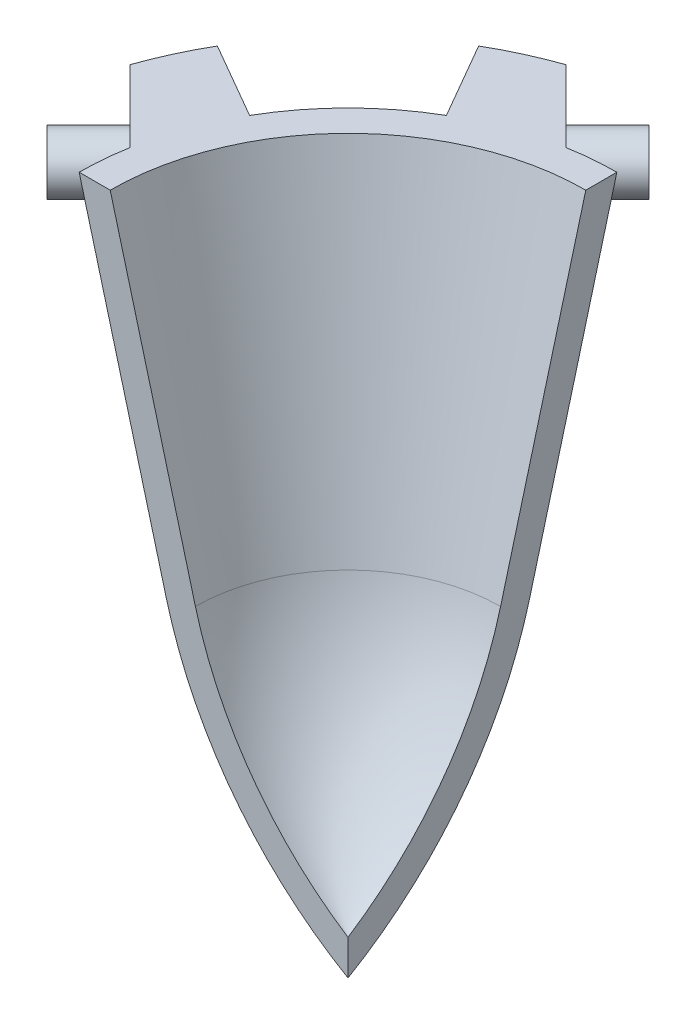
ISO-10303-21;
HEADER;
FILE_DESCRIPTION(('STEP AP214'),'2;1');
FILE_NAME('part.step','',(''),(''),'','','');
FILE_SCHEMA(('AUTOMOTIVE_DESIGN { 1 0 10303 214 1 1 1 1 }'));
ENDSEC;
DATA;
#1=APPLICATION_CONTEXT('core data for automotive mechanical design processes');
#2=APPLICATION_PROTOCOL_DEFINITION('international standard','automotive_design',2000,#1);
#3=PRODUCT_CONTEXT('',#1,'mechanical');
#4=PRODUCT('Part','Part','',(#3));
#5=PRODUCT_RELATED_PRODUCT_CATEGORY('part','',(#4));
#6=PRODUCT_DEFINITION_FORMATION('','',#4);
#7=PRODUCT_DEFINITION_CONTEXT('part definition',#1,'design');
#8=PRODUCT_DEFINITION('design','',#6,#7);
#9=PRODUCT_DEFINITION_SHAPE('','',#8);
#10=(LENGTH_UNIT() NAMED_UNIT(*) SI_UNIT(.MILLI.,.METRE.));
#11=(NAMED_UNIT(*) PLANE_ANGLE_UNIT() SI_UNIT($,.RADIAN.));
#12=(NAMED_UNIT(*) SI_UNIT($,.STERADIAN.) SOLID_ANGLE_UNIT());
#13=UNCERTAINTY_MEASURE_WITH_UNIT(LENGTH_MEASURE(1.E-05),#10,'distance_accuracy_value','');
#14=(GEOMETRIC_REPRESENTATION_CONTEXT(3) GLOBAL_UNCERTAINTY_ASSIGNED_CONTEXT((#13)) GLOBAL_UNIT_ASSIGNED_CONTEXT((#10,
#11,#12)) REPRESENTATION_CONTEXT('',''));
#15=CARTESIAN_POINT('',(0.,0.,0.));
#16=DIRECTION('',(0.,0.,1.));
#17=DIRECTION('',(1.,0.,0.));
#18=AXIS2_PLACEMENT_3D('',#15,#16,#17);
#19=CARTESIAN_POINT('',(0.,40.4976669186349,0.));
#20=DIRECTION('',(0.,1.,0.));
#21=DIRECTION('',(0.,0.,1.));
#22=AXIS2_PLACEMENT_3D('',#19,#20,#21);
#23=CONICAL_SURFACE('',#22,30.9350142441838,0.26179938779915);
#24=DIRECTION('',(0.25488700224418,-0.965925826289068,0.0449434555275456));
#25=VECTOR('',#24,1.);
#26=CARTESIAN_POINT('',(-41.1527344229323,80.9999999999999,-7.2563374086927));
#27=LINE('',#26,#25);
#28=CARTESIAN_POINT('',(-45.1109110547252,96.,-7.95427074328768));
#29=VERTEX_POINT('',#28);
#30=CARTESIAN_POINT('',(-41.1527344229322,80.9999999999999,-7.25633740869269));
#31=VERTEX_POINT('',#30);
#32=EDGE_CURVE('E70',#29,#31,#27,.T.);
#33=ORIENTED_EDGE('',*,*,#32,.T.);
#34=CARTESIAN_POINT('',(0.,80.9999999999999,1.34098829323386E-13));
#35=DIRECTION('',(0.,-1.,0.));
#36=DIRECTION('',(0.,0.,-1.));
#37=AXIS2_PLACEMENT_3D('',#34,#35,#36);
#38=CIRCLE('',#37,41.787581684912);
#39=CARTESIAN_POINT('',(-36.1891073018512,81.,-20.8937908424558));
#40=VERTEX_POINT('',#39);
#41=EDGE_CURVE('E282',#31,#40,#38,.T.);
#42=ORIENTED_EDGE('',*,*,#41,.T.);
#43=DIRECTION('',(0.224143868042015,-0.965925826289068,0.129409522551259));
#44=VECTOR('',#43,1.);
#45=CARTESIAN_POINT('',(-36.1891073018512,81.,-20.8937908424558));
#46=LINE('',#45,#44);
#47=CARTESIAN_POINT('',(-39.6698694153843,96.,-22.9034097856892));
#48=VERTEX_POINT('',#47);
#49=EDGE_CURVE('E302',#48,#40,#46,.T.);
#50=ORIENTED_EDGE('',*,*,#49,.F.);
#51=CARTESIAN_POINT('',(0.,96.,0.));
#52=DIRECTION('',(0.,-1.,0.));
#53=DIRECTION('',(0.,0.,-1.));
#54=AXIS2_PLACEMENT_3D('',#51,#52,#53);
#55=CIRCLE('',#54,45.8068195713788);
#56=CARTESIAN_POINT('',(-22.9034097856895,96.,-39.6698694153842));
#57=VERTEX_POINT('',#56);
#58=EDGE_CURVE('E239',#48,#57,#55,.T.);
#59=ORIENTED_EDGE('',*,*,#58,.T.);
#60=DIRECTION('',(0.129409522551262,-0.965925826289068,0.224143868042013));
#61=VECTOR('',#60,1.);
#62=CARTESIAN_POINT('',(-20.8937908424561,81.,-36.189107301851));
#63=LINE('',#62,#61);
#64=CARTESIAN_POINT('',(-20.8937908424561,81.,-36.189107301851));
#65=VERTEX_POINT('',#64);
#66=EDGE_CURVE('E262',#57,#65,#63,.T.);
#67=ORIENTED_EDGE('',*,*,#66,.T.);
#68=CARTESIAN_POINT('',(0.,80.9999999999999,1.34098829323386E-13));
#69=DIRECTION('',(0.,1.,0.));
#70=DIRECTION('',(0.,0.,1.));
#71=AXIS2_PLACEMENT_3D('',#68,#69,#70);
#72=CIRCLE('',#71,41.787581684912);
#73=CARTESIAN_POINT('',(-7.25633740869296,81.,-41.152734422932));
#74=VERTEX_POINT('',#73);
#75=EDGE_CURVE('E177',#74,#65,#72,.T.);
#76=ORIENTED_EDGE('',*,*,#75,.F.);
#77=DIRECTION('',(0.0449434555275482,-0.965925826289068,0.254887002244179));
#78=VECTOR('',#77,1.);
#79=CARTESIAN_POINT('',(-7.25633740869299,81.,-41.1527344229322));
#80=LINE('',#79,#78);
#81=CARTESIAN_POINT('',(-7.95427074328785,96.,-45.1109110547252));
#82=VERTEX_POINT('',#81);
#83=EDGE_CURVE('E187',#82,#74,#80,.T.);
#84=ORIENTED_EDGE('',*,*,#83,.F.);
#85=CARTESIAN_POINT('',(0.,96.,-45.8068195713788));
#86=VERTEX_POINT('',#85);
#87=EDGE_CURVE('E168',#82,#86,#55,.T.);
#88=ORIENTED_EDGE('',*,*,#87,.T.);
#89=DIRECTION('',(0.,0.965925826289068,-0.258819045102521));
#90=VECTOR('',#89,1.);
#91=CARTESIAN_POINT('',(0.,96.,-45.8068195713788));
#92=LINE('',#91,#90);
#93=CARTESIAN_POINT('',(0.,40.4976669186349,-30.9350142441838));
#94=VERTEX_POINT('',#93);
#95=EDGE_CURVE('E194',#94,#86,#92,.T.);
#96=ORIENTED_EDGE('',*,*,#95,.F.);
#97=CARTESIAN_POINT('',(0.,40.4976669186349,0.));
#98=DIRECTION('',(0.,-1.,0.));
#99=DIRECTION('',(0.,0.,-1.));
#100=AXIS2_PLACEMENT_3D('',#97,#98,#99);
#101=CIRCLE('',#100,30.9350142441838);
#102=CARTESIAN_POINT('',(-30.9350142441838,40.4976669186349,1.08009024950414E-13));
#103=VERTEX_POINT('',#102);
#104=EDGE_CURVE('E232',#103,#94,#101,.T.);
#105=ORIENTED_EDGE('',*,*,#104,.F.);
#106=DIRECTION('',(-0.258819045102521,0.965925826289068,0.));
#107=VECTOR('',#106,1.);
#108=CARTESIAN_POINT('',(-45.8068195713788,96.,1.59933655725223E-13));
#109=LINE('',#108,#107);
#110=CARTESIAN_POINT('',(-45.8068195713788,96.,1.59933655725223E-13));
#111=VERTEX_POINT('',#110);
#112=EDGE_CURVE('E212',#103,#111,#109,.T.);
#113=ORIENTED_EDGE('',*,*,#112,.T.);
#114=EDGE_CURVE('E235',#111,#29,#55,.T.);
#115=ORIENTED_EDGE('',*,*,#114,.T.);
#116=EDGE_LOOP('',(#33,#42,#50,#59,#67,#76,#84,#88,#96,#105,#113,#115));
#117=FACE_BOUND('',#116,.T.);
#118=ADVANCED_FACE('F46',(#117),#23,.T.);
#119=CARTESIAN_POINT('',(0.,57.8220104129191,33.7203158842601));
#120=DIRECTION('',(-1.,0.,0.));
#121=DIRECTION('',(0.,0.,-1.));
#122=AXIS2_PLACEMENT_3D('',#119,#120,#121);
#123=CIRCLE('',#122,66.9361232185283);
#124=TRIMMED_CURVE('',#123,(PARAMETER_VALUE(-1.04284047340818)),
(PARAMETER_VALUE(1.04284047340818)),.T.,.PARAMETER.);
#125=CARTESIAN_POINT('',(0.,57.8220104129191,0.));
#126=DIRECTION('',(0.,-1.,0.));
#127=AXIS1_PLACEMENT('',#125,#126);
#128=SURFACE_OF_REVOLUTION('',#124,#127);
#129=CARTESIAN_POINT('',(0.,57.8220104129191,33.7203158842601));
#130=DIRECTION('',(1.,0.,0.));
#131=DIRECTION('',(0.,0.,1.));
#132=AXIS2_PLACEMENT_3D('',#129,#130,#131);
#133=CIRCLE('',#132,66.9361232185283);
#134=CARTESIAN_POINT('',(0.,0.,0.));
#135=VERTEX_POINT('',#134);
#136=EDGE_CURVE('E185',#135,#94,#133,.T.);
#137=ORIENTED_EDGE('',*,*,#136,.F.);
#138=CARTESIAN_POINT('',(33.7203158842601,57.8220104129191,-1.1773385364979E-13));
#139=DIRECTION('',(0.,0.,-1.));
#140=DIRECTION('',(1.,0.,0.));
#141=AXIS2_PLACEMENT_3D('',#138,#139,#140);
#142=CIRCLE('',#141,66.9361232185283);
#143=EDGE_CURVE('E208',#135,#103,#142,.T.);
#144=ORIENTED_EDGE('',*,*,#143,.T.);
#145=ORIENTED_EDGE('',*,*,#104,.T.);
#146=EDGE_LOOP('',(#137,#144,#145));
#147=FACE_BOUND('',#146,.T.);
#148=ADVANCED_FACE('F367',(#147),#128,.T.);
#149=CARTESIAN_POINT('',(0.,57.8220104129191,33.7203158842601));
#150=DIRECTION('',(-1.,0.,0.));
#151=DIRECTION('',(0.,0.,-1.));
#152=AXIS2_PLACEMENT_3D('',#149,#150,#151);
#153=CIRCLE('',#152,61.8270205215404);
#154=TRIMMED_CURVE('',#153,(PARAMETER_VALUE(-0.993932782259442)),
(PARAMETER_VALUE(0.993932782259442)),.T.,.PARAMETER.);
#155=CARTESIAN_POINT('',(0.,57.8220104129191,0.));
#156=DIRECTION('',(0.,-1.,0.));
#157=AXIS1_PLACEMENT('',#155,#156);
#158=SURFACE_OF_REVOLUTION('',#154,#157);
#159=CARTESIAN_POINT('',(0.,41.82,0.));
#160=DIRECTION('',(0.,-1.,0.));
#161=DIRECTION('',(0.,0.,-1.));
#162=AXIS2_PLACEMENT_3D('',#159,#160,#161);
#163=CIRCLE('',#162,26.);
#164=CARTESIAN_POINT('',(-26.,41.82,0.));
#165=VERTEX_POINT('',#164);
#166=CARTESIAN_POINT('',(0.,41.82,-26.));
#167=VERTEX_POINT('',#166);
#168=EDGE_CURVE('E242',#165,#167,#163,.T.);
#169=ORIENTED_EDGE('',*,*,#168,.F.);
#170=CARTESIAN_POINT('',(33.7203158842601,57.8220104129191,-1.1773385364979E-13));
#171=DIRECTION('',(0.,0.,1.));
#172=DIRECTION('',(-1.,0.,0.));
#173=AXIS2_PLACEMENT_3D('',#170,#171,#172);
#174=CIRCLE('',#173,61.8270205215404);
#175=CARTESIAN_POINT('',(0.,6.,0.));
#176=VERTEX_POINT('',#175);
#177=EDGE_CURVE('E224',#165,#176,#174,.T.);
#178=ORIENTED_EDGE('',*,*,#177,.T.);
#179=CARTESIAN_POINT('',(0.,57.8220104129191,33.7203158842601));
#180=DIRECTION('',(-1.,0.,0.));
#181=DIRECTION('',(0.,0.,-1.));
#182=AXIS2_PLACEMENT_3D('',#179,#180,#181);
#183=CIRCLE('',#182,61.8270205215404);
#184=EDGE_CURVE('E206',#167,#176,#183,.T.);
#185=ORIENTED_EDGE('',*,*,#184,.F.);
#186=EDGE_LOOP('',(#169,#178,#185));
#187=FACE_BOUND('',#186,.T.);
#188=ADVANCED_FACE('F48',(#187),#158,.F.);
#189=CARTESIAN_POINT('',(0.,96.,0.));
#190=DIRECTION('',(0.,1.,0.));
#191=DIRECTION('',(0.,0.,1.));
#192=AXIS2_PLACEMENT_3D('',#189,#190,#191);
#193=CONICAL_SURFACE('',#192,40.5174872459183,0.26179938779915);
#194=CARTESIAN_POINT('',(0.,96.,0.));
#195=DIRECTION('',(0.,-1.,0.));
#196=DIRECTION('',(0.,0.,-1.));
#197=AXIS2_PLACEMENT_3D('',#194,#195,#196);
#198=CIRCLE('',#197,40.5174872459183);
#199=CARTESIAN_POINT('',(-40.5174872459183,96.,1.41466050615938E-13));
#200=VERTEX_POINT('',#199);
#201=CARTESIAN_POINT('',(0.,96.,-40.5174872459183));
#202=VERTEX_POINT('',#201);
#203=EDGE_CURVE('E238',#200,#202,#198,.T.);
#204=ORIENTED_EDGE('',*,*,#203,.F.);
#205=DIRECTION('',(0.258819045102522,-0.965925826289068,0.));
#206=VECTOR('',#205,1.);
#207=CARTESIAN_POINT('',(-26.,41.82,0.));
#208=LINE('',#207,#206);
#209=EDGE_CURVE('E220',#200,#165,#208,.T.);
#210=ORIENTED_EDGE('',*,*,#209,.T.);
#211=ORIENTED_EDGE('',*,*,#168,.T.);
#212=DIRECTION('',(0.,-0.965925826289068,0.258819045102522));
#213=VECTOR('',#212,1.);
#214=CARTESIAN_POINT('',(0.,41.82,-26.));
#215=LINE('',#214,#213);
#216=EDGE_CURVE('E202',#202,#167,#215,.T.);
#217=ORIENTED_EDGE('',*,*,#216,.F.);
#218=EDGE_LOOP('',(#204,#210,#211,#217));
#219=FACE_BOUND('',#218,.T.);
#220=ADVANCED_FACE('F377',(#219),#193,.F.);
#221=CARTESIAN_POINT('',(-40.5174872459183,96.,1.41466050615938E-13));
#222=DIRECTION('',(0.,1.,0.));
#223=DIRECTION('',(0.,0.,1.));
#224=AXIS2_PLACEMENT_3D('',#221,#222,#223);
#225=PLANE('',#224);
#226=DIRECTION('',(0.707106781186549,0.,0.707106781186546));
#227=VECTOR('',#226,1.);
#228=CARTESIAN_POINT('',(-7.95427074328785,96.,-45.1109110547252));
#229=LINE('',#228,#227);
#230=CARTESIAN_POINT('',(-20.19771204698,96.,-57.3543523584173));
#231=VERTEX_POINT('',#230);
#232=EDGE_CURVE('E151',#231,#82,#229,.T.);
#233=ORIENTED_EDGE('',*,*,#232,.F.);
#234=CARTESIAN_POINT('',(0.,95.9999999999999,1.58931945864753E-13));
#235=DIRECTION('',(0.,1.,0.));
#236=DIRECTION('',(0.,0.,1.));
#237=AXIS2_PLACEMENT_3D('',#234,#235,#236);
#238=CIRCLE('',#237,60.8068195713789);
#239=CARTESIAN_POINT('',(-30.4034097856895,96.,-52.6602504721507));
#240=VERTEX_POINT('',#239);
#241=EDGE_CURVE('E165',#231,#240,#238,.T.);
#242=ORIENTED_EDGE('',*,*,#241,.T.);
#243=DIRECTION('',(0.500000000000001,0.,0.866025403784438));
#244=VECTOR('',#243,1.);
#245=CARTESIAN_POINT('',(-22.9034097856895,96.,-39.6698694153842));
#246=LINE('',#245,#244);
#247=EDGE_CURVE('E267',#240,#57,#246,.T.);
#248=ORIENTED_EDGE('',*,*,#247,.T.);
#249=ORIENTED_EDGE('',*,*,#58,.F.);
#250=DIRECTION('',(0.86602540378444,0.,0.499999999999998));
#251=VECTOR('',#250,1.);
#252=CARTESIAN_POINT('',(-39.6698694153843,96.,-22.9034097856892));
#253=LINE('',#252,#251);
#254=CARTESIAN_POINT('',(-52.6602504721509,96.,-30.4034097856891));
#255=VERTEX_POINT('',#254);
#256=EDGE_CURVE('E290',#255,#48,#253,.T.);
#257=ORIENTED_EDGE('',*,*,#256,.F.);
#258=CARTESIAN_POINT('',(0.,95.9999999999999,1.58931945864753E-13));
#259=DIRECTION('',(0.,-1.,0.));
#260=DIRECTION('',(0.,0.,-1.));
#261=AXIS2_PLACEMENT_3D('',#258,#259,#260);
#262=CIRCLE('',#261,60.8068195713788);
#263=CARTESIAN_POINT('',(-57.3543523584174,96.,-20.1977120469798));
#264=VERTEX_POINT('',#263);
#265=EDGE_CURVE('E276',#264,#255,#262,.T.);
#266=ORIENTED_EDGE('',*,*,#265,.F.);
#267=DIRECTION('',(-0.707106781186549,0.,-0.707106781186546));
#268=VECTOR('',#267,1.);
#269=CARTESIAN_POINT('',(-45.1109110547252,96.,-7.95427074328768));
#270=LINE('',#269,#268);
#271=EDGE_CURVE('E170',#29,#264,#270,.T.);
#272=ORIENTED_EDGE('',*,*,#271,.F.);
#273=ORIENTED_EDGE('',*,*,#114,.F.);
#274=DIRECTION('',(1.,0.,0.));
#275=VECTOR('',#274,1.);
#276=CARTESIAN_POINT('',(-40.5174872459183,96.,1.41466050615938E-13));
#277=LINE('',#276,#275);
#278=EDGE_CURVE('E216',#111,#200,#277,.T.);
#279=ORIENTED_EDGE('',*,*,#278,.T.);
#280=ORIENTED_EDGE('',*,*,#203,.T.);
#281=DIRECTION('',(0.,0.,1.));
#282=VECTOR('',#281,1.);
#283=CARTESIAN_POINT('',(0.,96.,-40.5174872459183));
#284=LINE('',#283,#282);
#285=EDGE_CURVE('E198',#86,#202,#284,.T.);
#286=ORIENTED_EDGE('',*,*,#285,.F.);
#287=ORIENTED_EDGE('',*,*,#87,.F.);
#288=EDGE_LOOP('',(#233,#242,#248,#249,#257,#266,#272,#273,#279,#280,#286,#287));
#289=FACE_BOUND('',#288,.T.);
#290=ADVANCED_FACE('F163',(#289),#225,.T.);
#291=CARTESIAN_POINT('',(33.7203158842601,57.8220104129191,-1.1773385364979E-13));
#292=DIRECTION('',(0.,0.,1.));
#293=DIRECTION('',(1.,0.,0.));
#294=AXIS2_PLACEMENT_3D('',#291,#292,#293);
#295=PLANE('',#294);
#296=ORIENTED_EDGE('',*,*,#143,.F.);
#297=DIRECTION('',(0.,-1.,0.));
#298=VECTOR('',#297,1.);
#299=CARTESIAN_POINT('',(0.,0.,0.));
#300=LINE('',#299,#298);
#301=EDGE_CURVE('E228',#176,#135,#300,.T.);
#302=ORIENTED_EDGE('',*,*,#301,.F.);
#303=ORIENTED_EDGE('',*,*,#177,.F.);
#304=ORIENTED_EDGE('',*,*,#209,.F.);
#305=ORIENTED_EDGE('',*,*,#278,.F.);
#306=ORIENTED_EDGE('',*,*,#112,.F.);
#307=EDGE_LOOP('',(#296,#302,#303,#304,#305,#306));
#308=FACE_BOUND('',#307,.T.);
#309=ADVANCED_FACE('F364',(#308),#295,.T.);
#310=CARTESIAN_POINT('',(0.,57.8220104129191,33.7203158842601));
#311=DIRECTION('',(-1.,0.,0.));
#312=DIRECTION('',(0.,0.,1.));
#313=AXIS2_PLACEMENT_3D('',#310,#311,#312);
#314=PLANE('',#313);
#315=ORIENTED_EDGE('',*,*,#136,.T.);
#316=ORIENTED_EDGE('',*,*,#95,.T.);
#317=ORIENTED_EDGE('',*,*,#285,.T.);
#318=ORIENTED_EDGE('',*,*,#216,.T.);
#319=ORIENTED_EDGE('',*,*,#184,.T.);
#320=ORIENTED_EDGE('',*,*,#301,.T.);
#321=EDGE_LOOP('',(#315,#316,#317,#318,#319,#320));
#322=FACE_BOUND('',#321,.T.);
#323=ADVANCED_FACE('F358',(#322),#314,.F.);
#324=CARTESIAN_POINT('',(-9.86106007369694,81.,-55.9248507181153));
#325=DIRECTION('',(0.,1.,0.));
#326=DIRECTION('',(0.,0.,1.));
#327=AXIS2_PLACEMENT_3D('',#324,#325,#326);
#328=PLANE('',#327);
#329=CARTESIAN_POINT('',(0.,80.9999999999999,1.34098829323386E-13));
#330=DIRECTION('',(0.,1.,0.));
#331=DIRECTION('',(0.,0.,1.));
#332=AXIS2_PLACEMENT_3D('',#329,#330,#331);
#333=CIRCLE('',#332,56.787581684912);
#334=CARTESIAN_POINT('',(-17.0202856737502,81.,-54.1769259851874));
#335=VERTEX_POINT('',#334);
#336=CARTESIAN_POINT('',(-28.3937908424561,81.,-49.1794883586176));
#337=VERTEX_POINT('',#336);
#338=EDGE_CURVE('E178',#335,#337,#333,.T.);
#339=ORIENTED_EDGE('',*,*,#338,.F.);
#340=DIRECTION('',(0.707106781186549,0.,0.707106781186546));
#341=VECTOR('',#340,1.);
#342=CARTESIAN_POINT('',(-14.3146352401875,81.,-51.4712755516248));
#343=LINE('',#342,#341);
#344=CARTESIAN_POINT('',(-7.95427074328785,81.,-45.1109110547252));
#345=VERTEX_POINT('',#344);
#346=EDGE_CURVE('E154',#335,#345,#343,.T.);
#347=ORIENTED_EDGE('',*,*,#346,.T.);
#348=DIRECTION('',(-0.173648177666931,0.,-0.984807753012208));
#349=VECTOR('',#348,1.);
#350=CARTESIAN_POINT('',(-9.86106007369694,81.,-55.9248507181153));
#351=LINE('',#350,#349);
#352=EDGE_CURVE('E256',#74,#345,#351,.T.);
#353=ORIENTED_EDGE('',*,*,#352,.F.);
#354=ORIENTED_EDGE('',*,*,#75,.T.);
#355=DIRECTION('',(-0.500000000000001,0.,-0.866025403784438));
#356=VECTOR('',#355,1.);
#357=CARTESIAN_POINT('',(-28.3937908424561,81.,-49.1794883586176));
#358=LINE('',#357,#356);
#359=EDGE_CURVE('E272',#65,#337,#358,.T.);
#360=ORIENTED_EDGE('',*,*,#359,.T.);
#361=EDGE_LOOP('',(#339,#347,#353,#354,#360));
#362=FACE_BOUND('',#361,.T.);
#363=ADVANCED_FACE('F356',(#362),#328,.F.);
#364=CARTESIAN_POINT('',(0.,80.9999999999999,1.34098829323386E-13));
#365=DIRECTION('',(0.,1.,0.));
#366=DIRECTION('',(0.,0.,1.));
#367=AXIS2_PLACEMENT_3D('',#364,#365,#366);
#368=CONICAL_SURFACE('',#367,56.787581684912,0.261799387799151);
#369=ORIENTED_EDGE('',*,*,#241,.F.);
#370=CARTESIAN_POINT('',(-20.197754065556,96.0002,-57.3543943769933));
#371=CARTESIAN_POINT('',(-19.9349531132204,94.7493243187658,-57.0915934246576));
#372=CARTESIAN_POINT('',(-19.671695468186,93.498640430178,-56.8283357796232));
#373=CARTESIAN_POINT('',(-19.1442063291271,90.9976853477497,-56.3008466405643));
#374=CARTESIAN_POINT('',(-18.8799748364466,89.7474141533421,-56.0366151478838));
#375=CARTESIAN_POINT('',(-18.3504767772902,87.2473099451603,-55.5071170887274));
#376=CARTESIAN_POINT('',(-18.0852102106717,85.9974769314464,-55.241850522109));
#377=CARTESIAN_POINT('',(-17.5535723536648,83.4982790474525,-54.7102126651021));
#378=CARTESIAN_POINT('',(-17.2872010617526,82.2489141778207,-54.4438413731899));
#379=CARTESIAN_POINT('',(-17.0202429299734,80.9998,-54.1768832414107));
#380=B_SPLINE_CURVE_WITH_KNOTS('',3,(#370,#371,#372,#373,#374,#375,#376,#377,#378,#379),
.UNSPECIFIED.,.F.,.F.,(4,2,2,2,4),(0.,3.91476277887172,7.82952015714088,11.7442780744685,
15.6590413930997),.UNSPECIFIED.);
#381=EDGE_CURVE('E148',#231,#335,#380,.T.);
#382=ORIENTED_EDGE('',*,*,#381,.T.);
#383=ORIENTED_EDGE('',*,*,#338,.T.);
#384=DIRECTION('',(-0.129409522551262,0.965925826289068,-0.224143868042013));
#385=VECTOR('',#384,1.);
#386=CARTESIAN_POINT('',(-30.4034097856895,96.,-52.6602504721507));
#387=LINE('',#386,#385);
#388=EDGE_CURVE('E174',#337,#240,#387,.T.);
#389=ORIENTED_EDGE('',*,*,#388,.T.);
#390=EDGE_LOOP('',(#369,#382,#383,#389));
#391=FACE_BOUND('',#390,.T.);
#392=ADVANCED_FACE('F172',(#391),#368,.T.);
#393=CARTESIAN_POINT('',(0.,0.,0.));
#394=DIRECTION('',(-0.984807753012208,0.,0.173648177666931));
#395=DIRECTION('',(0.173648177666931,0.,0.984807753012208));
#396=AXIS2_PLACEMENT_3D('',#393,#394,#395);
#397=PLANE('',#396);
#398=ORIENTED_EDGE('',*,*,#352,.T.);
#399=DIRECTION('',(0.,1.,0.));
#400=VECTOR('',#399,1.);
#401=CARTESIAN_POINT('',(-7.95427074328781,0.,-45.1109110547251));
#402=LINE('',#401,#400);
#403=EDGE_CURVE('E55',#345,#82,#402,.T.);
#404=ORIENTED_EDGE('',*,*,#403,.T.);
#405=ORIENTED_EDGE('',*,*,#83,.T.);
#406=EDGE_LOOP('',(#398,#404,#405));
#407=FACE_BOUND('',#406,.T.);
#408=ADVANCED_FACE('F254',(#407),#397,.F.);
#409=CARTESIAN_POINT('',(0.,0.,0.));
#410=DIRECTION('',(-0.866025403784438,0.,0.500000000000001));
#411=DIRECTION('',(0.500000000000001,0.,0.866025403784438));
#412=AXIS2_PLACEMENT_3D('',#409,#410,#411);
#413=PLANE('',#412);
#414=ORIENTED_EDGE('',*,*,#359,.F.);
#415=ORIENTED_EDGE('',*,*,#66,.F.);
#416=ORIENTED_EDGE('',*,*,#247,.F.);
#417=ORIENTED_EDGE('',*,*,#388,.F.);
#418=EDGE_LOOP('',(#414,#415,#416,#417));
#419=FACE_BOUND('',#418,.T.);
#420=ADVANCED_FACE('F350',(#419),#413,.T.);
#421=CARTESIAN_POINT('',(0.,80.9999999999999,1.34098829323386E-13));
#422=DIRECTION('',(0.,1.,0.));
#423=DIRECTION('',(0.,0.,1.));
#424=AXIS2_PLACEMENT_3D('',#421,#422,#423);
#425=CONICAL_SURFACE('',#424,56.787581684912,0.26179938779915);
#426=CARTESIAN_POINT('',(-57.3543943769934,96.0002,-20.1977540655558));
#427=CARTESIAN_POINT('',(-57.0915934246578,94.7493243187657,-19.9349531132202));
#428=CARTESIAN_POINT('',(-56.8283357796233,93.498640430178,-19.6716954681858));
#429=CARTESIAN_POINT('',(-56.3008466405644,90.9976853477496,-19.1442063291269));
#430=CARTESIAN_POINT('',(-56.0366151478839,89.747414153342,-18.8799748364464));
#431=CARTESIAN_POINT('',(-55.5071170887275,87.2473099451602,-18.35047677729));
#432=CARTESIAN_POINT('',(-55.2418505221091,85.9974769314464,-18.0852102106715));
#433=CARTESIAN_POINT('',(-54.7102126651022,83.4982790474525,-17.5535723536646));
#434=CARTESIAN_POINT('',(-54.44384137319,82.2489141778207,-17.2872010617524));
#435=CARTESIAN_POINT('',(-54.1768832414108,80.9997999999999,-17.0202429299732));
#436=B_SPLINE_CURVE_WITH_KNOTS('',3,(#426,#427,#428,#429,#430,#431,#432,#433,#434,#435),
.UNSPECIFIED.,.F.,.F.,(4,2,2,2,4),(0.,3.91476277887172,7.8295201571409,11.7442780744685,
15.6590413930997),.UNSPECIFIED.);
#437=CARTESIAN_POINT('',(-54.1769259851875,81.,-17.02028567375));
#438=VERTEX_POINT('',#437);
#439=EDGE_CURVE('E159',#264,#438,#436,.T.);
#440=ORIENTED_EDGE('',*,*,#439,.F.);
#441=ORIENTED_EDGE('',*,*,#265,.T.);
#442=DIRECTION('',(-0.224143868042015,0.965925826289068,-0.129409522551259));
#443=VECTOR('',#442,1.);
#444=CARTESIAN_POINT('',(-52.6602504721509,96.,-30.4034097856891));
#445=LINE('',#444,#443);
#446=CARTESIAN_POINT('',(-49.1794883586178,81.,-28.3937908424557));
#447=VERTEX_POINT('',#446);
#448=EDGE_CURVE('E294',#447,#255,#445,.T.);
#449=ORIENTED_EDGE('',*,*,#448,.F.);
#450=CARTESIAN_POINT('',(0.,80.9999999999999,1.34098829323386E-13));
#451=DIRECTION('',(0.,-1.,0.));
#452=DIRECTION('',(0.,0.,-1.));
#453=AXIS2_PLACEMENT_3D('',#450,#451,#452);
#454=CIRCLE('',#453,56.787581684912);
#455=EDGE_CURVE('E279',#438,#447,#454,.T.);
#456=ORIENTED_EDGE('',*,*,#455,.F.);
#457=EDGE_LOOP('',(#440,#441,#449,#456));
#458=FACE_BOUND('',#457,.T.);
#459=ADVANCED_FACE('F345',(#458),#425,.T.);
#460=CARTESIAN_POINT('',(-55.9248507181154,80.9999999999999,-9.86106007369661));
#461=DIRECTION('',(0.,-1.,0.));
#462=DIRECTION('',(0.,0.,-1.));
#463=AXIS2_PLACEMENT_3D('',#460,#461,#462);
#464=PLANE('',#463);
#465=DIRECTION('',(0.707106781186549,0.,0.707106781186546));
#466=VECTOR('',#465,1.);
#467=CARTESIAN_POINT('',(-51.4712755516248,81.,-14.3146352401873));
#468=LINE('',#467,#466);
#469=CARTESIAN_POINT('',(-45.110911054725,80.9999999999999,-7.95427074328749));
#470=VERTEX_POINT('',#469);
#471=EDGE_CURVE('E62',#438,#470,#468,.T.);
#472=ORIENTED_EDGE('',*,*,#471,.F.);
#473=ORIENTED_EDGE('',*,*,#455,.T.);
#474=DIRECTION('',(-0.86602540378444,0.,-0.499999999999998));
#475=VECTOR('',#474,1.);
#476=CARTESIAN_POINT('',(-49.1794883586178,81.,-28.3937908424557));
#477=LINE('',#476,#475);
#478=EDGE_CURVE('E298',#40,#447,#477,.T.);
#479=ORIENTED_EDGE('',*,*,#478,.F.);
#480=ORIENTED_EDGE('',*,*,#41,.F.);
#481=DIRECTION('',(-0.984807753012208,0.,-0.173648177666927));
#482=VECTOR('',#481,1.);
#483=CARTESIAN_POINT('',(-55.9248507181154,80.9999999999999,-9.86106007369661));
#484=LINE('',#483,#482);
#485=EDGE_CURVE('E285',#31,#470,#484,.T.);
#486=ORIENTED_EDGE('',*,*,#485,.T.);
#487=EDGE_LOOP('',(#472,#473,#479,#480,#486));
#488=FACE_BOUND('',#487,.T.);
#489=ADVANCED_FACE('F342',(#488),#464,.T.);
#490=CARTESIAN_POINT('',(0.,0.,0.));
#491=DIRECTION('',(-0.173648177666927,0.,0.984807753012208));
#492=DIRECTION('',(0.984807753012209,0.,0.173648177666927));
#493=AXIS2_PLACEMENT_3D('',#490,#491,#492);
#494=PLANE('',#493);
#495=DIRECTION('',(0.,1.,0.));
#496=VECTOR('',#495,1.);
#497=CARTESIAN_POINT('',(-45.1109110547252,1.04034485166735E-13,-7.95427074328765));
#498=LINE('',#497,#496);
#499=EDGE_CURVE('E245',#470,#29,#498,.T.);
#500=ORIENTED_EDGE('',*,*,#499,.F.);
#501=ORIENTED_EDGE('',*,*,#485,.F.);
#502=ORIENTED_EDGE('',*,*,#32,.F.);
#503=EDGE_LOOP('',(#500,#501,#502));
#504=FACE_BOUND('',#503,.T.);
#505=ADVANCED_FACE('F338',(#504),#494,.T.);
#506=CARTESIAN_POINT('',(0.,0.,0.));
#507=DIRECTION('',(-0.499999999999998,0.,0.86602540378444));
#508=DIRECTION('',(0.86602540378444,0.,0.499999999999998));
#509=AXIS2_PLACEMENT_3D('',#506,#507,#508);
#510=PLANE('',#509);
#511=ORIENTED_EDGE('',*,*,#49,.T.);
#512=ORIENTED_EDGE('',*,*,#478,.T.);
#513=ORIENTED_EDGE('',*,*,#448,.T.);
#514=ORIENTED_EDGE('',*,*,#256,.T.);
#515=EDGE_LOOP('',(#511,#512,#513,#514));
#516=FACE_BOUND('',#515,.T.);
#517=ADVANCED_FACE('F334',(#516),#510,.F.);
#518=CARTESIAN_POINT('',(-45.1109110547252,0.,-7.95427074328768));
#519=DIRECTION('',(0.707106781186546,0.,-0.707106781186549));
#520=DIRECTION('',(-0.707106781186549,0.,-0.707106781186546));
#521=AXIS2_PLACEMENT_3D('',#518,#519,#520);
#522=PLANE('',#521);
#523=CARTESIAN_POINT('',(-50.4382751132639,88.5,-13.2816348018261));
#524=DIRECTION('',(0.707106781186546,0.,-0.707106781186549));
#525=DIRECTION('',(-0.707106781186549,0.,-0.707106781186546));
#526=AXIS2_PLACEMENT_3D('',#523,#524,#525);
#527=CIRCLE('',#526,4.5);
#528=CARTESIAN_POINT('',(-53.6202556286034,88.5,-16.4636153171656));
#529=VERTEX_POINT('',#528);
#530=EDGE_CURVE('E413',#529,#529,#527,.T.);
#531=ORIENTED_EDGE('',*,*,#530,.T.);
#532=EDGE_LOOP('',(#531));
#533=FACE_BOUND('',#532,.T.);
#534=ORIENTED_EDGE('',*,*,#439,.T.);
#535=ORIENTED_EDGE('',*,*,#471,.T.);
#536=ORIENTED_EDGE('',*,*,#499,.T.);
#537=ORIENTED_EDGE('',*,*,#271,.T.);
#538=EDGE_LOOP('',(#534,#535,#536,#537));
#539=FACE_BOUND('',#538,.T.);
#540=ADVANCED_FACE('F328',(#533,#539),#522,.F.);
#541=CARTESIAN_POINT('',(-7.95427074328785,0.,-45.1109110547252));
#542=DIRECTION('',(-0.707106781186546,0.,0.707106781186549));
#543=DIRECTION('',(0.707106781186549,0.,0.707106781186546));
#544=AXIS2_PLACEMENT_3D('',#541,#542,#543);
#545=PLANE('',#544);
#546=CARTESIAN_POINT('',(-13.2816348018265,88.5,-50.4382751132637));
#547=DIRECTION('',(-0.707106781186546,0.,0.707106781186549));
#548=DIRECTION('',(0.707106781186549,0.,0.707106781186546));
#549=AXIS2_PLACEMENT_3D('',#546,#547,#548);
#550=CIRCLE('',#549,4.5);
#551=CARTESIAN_POINT('',(-10.099654286487,88.5,-47.2562945979243));
#552=VERTEX_POINT('',#551);
#553=EDGE_CURVE('E11',#552,#552,#550,.F.);
#554=ORIENTED_EDGE('',*,*,#553,.F.);
#555=EDGE_LOOP('',(#554));
#556=FACE_BOUND('',#555,.T.);
#557=ORIENTED_EDGE('',*,*,#381,.F.);
#558=ORIENTED_EDGE('',*,*,#232,.T.);
#559=ORIENTED_EDGE('',*,*,#403,.F.);
#560=ORIENTED_EDGE('',*,*,#346,.F.);
#561=EDGE_LOOP('',(#557,#558,#559,#560));
#562=FACE_BOUND('',#561,.T.);
#563=ADVANCED_FACE('F150',(#556,#562),#545,.F.);
#564=CARTESIAN_POINT('',(-6.21056698996101,88.5,-57.5093429251292));
#565=DIRECTION('',(-0.707106781186546,0.,0.707106781186549));
#566=DIRECTION('',(0.707106781186549,0.,0.707106781186546));
#567=AXIS2_PLACEMENT_3D('',#564,#565,#566);
#568=CYLINDRICAL_SURFACE('',#567,4.5);
#569=CARTESIAN_POINT('',(-6.21056698996101,88.5,-57.5093429251292));
#570=DIRECTION('',(0.707106781186546,0.,-0.707106781186549));
#571=DIRECTION('',(-0.707106781186549,0.,-0.707106781186546));
#572=AXIS2_PLACEMENT_3D('',#569,#570,#571);
#573=CIRCLE('',#572,4.5);
#574=CARTESIAN_POINT('',(-9.39254750530048,88.5,-60.6913234404687));
#575=VERTEX_POINT('',#574);
#576=EDGE_CURVE('E412',#575,#575,#573,.T.);
#577=ORIENTED_EDGE('',*,*,#576,.F.);
#578=EDGE_LOOP('',(#577));
#579=FACE_BOUND('',#578,.T.);
#580=ORIENTED_EDGE('',*,*,#553,.T.);
#581=EDGE_LOOP('',(#580));
#582=FACE_BOUND('',#581,.T.);
#583=ADVANCED_FACE('F327',(#579,#582),#568,.T.);
#584=CARTESIAN_POINT('',(-6.21056698996101,88.5,-57.5093429251292));
#585=DIRECTION('',(0.707106781186546,0.,-0.707106781186549));
#586=DIRECTION('',(-0.707106781186549,0.,-0.707106781186546));
#587=AXIS2_PLACEMENT_3D('',#584,#585,#586);
#588=PLANE('',#587);
#589=ORIENTED_EDGE('',*,*,#576,.T.);
#590=EDGE_LOOP('',(#589));
#591=FACE_BOUND('',#590,.T.);
#592=ADVANCED_FACE('F470',(#591),#588,.T.);
#593=CARTESIAN_POINT('',(-57.5093429251294,88.4999999999999,-6.21056698996066));
#594=DIRECTION('',(0.707106781186546,0.,-0.707106781186549));
#595=DIRECTION('',(-0.707106781186549,0.,-0.707106781186546));
#596=AXIS2_PLACEMENT_3D('',#593,#594,#595);
#597=CYLINDRICAL_SURFACE('',#596,4.5);
#598=CARTESIAN_POINT('',(-57.5093429251294,88.4999999999999,-6.21056698996066));
#599=DIRECTION('',(0.707106781186546,0.,-0.707106781186549));
#600=DIRECTION('',(-0.707106781186549,0.,-0.707106781186546));
#601=AXIS2_PLACEMENT_3D('',#598,#599,#600);
#602=CIRCLE('',#601,4.5);
#603=CARTESIAN_POINT('',(-60.6913234404689,88.4999999999999,-9.39254750530012));
#604=VERTEX_POINT('',#603);
#605=EDGE_CURVE('E409',#604,#604,#602,.T.);
#606=ORIENTED_EDGE('',*,*,#605,.T.);
#607=EDGE_LOOP('',(#606));
#608=FACE_BOUND('',#607,.T.);
#609=ORIENTED_EDGE('',*,*,#530,.F.);
#610=EDGE_LOOP('',(#609));
#611=FACE_BOUND('',#610,.T.);
#612=ADVANCED_FACE('F467',(#608,#611),#597,.T.);
#613=CARTESIAN_POINT('',(-57.5093429251294,88.4999999999999,-6.21056698996066));
#614=DIRECTION('',(-0.707106781186546,0.,0.707106781186549));
#615=DIRECTION('',(-0.707106781186549,0.,-0.707106781186546));
#616=AXIS2_PLACEMENT_3D('',#613,#614,#615);
#617=PLANE('',#616);
#618=ORIENTED_EDGE('',*,*,#605,.F.);
#619=EDGE_LOOP('',(#618));
#620=FACE_BOUND('',#619,.T.);
#621=ADVANCED_FACE('F469',(#620),#617,.T.);
#622=CLOSED_SHELL('',(#118,#148,#188,#220,#290,#309,#323,#363,#392,#408,#420,#459,#489,#505,
#517,#540,#563,#583,#592,#612,#621));
#623=MANIFOLD_SOLID_BREP('B2',#622);
#624=ADVANCED_BREP_SHAPE_REPRESENTATION('',(#18,#623),#14);
#625=SHAPE_DEFINITION_REPRESENTATION(#9,#624);
ENDSEC;
END-ISO-10303-21;
